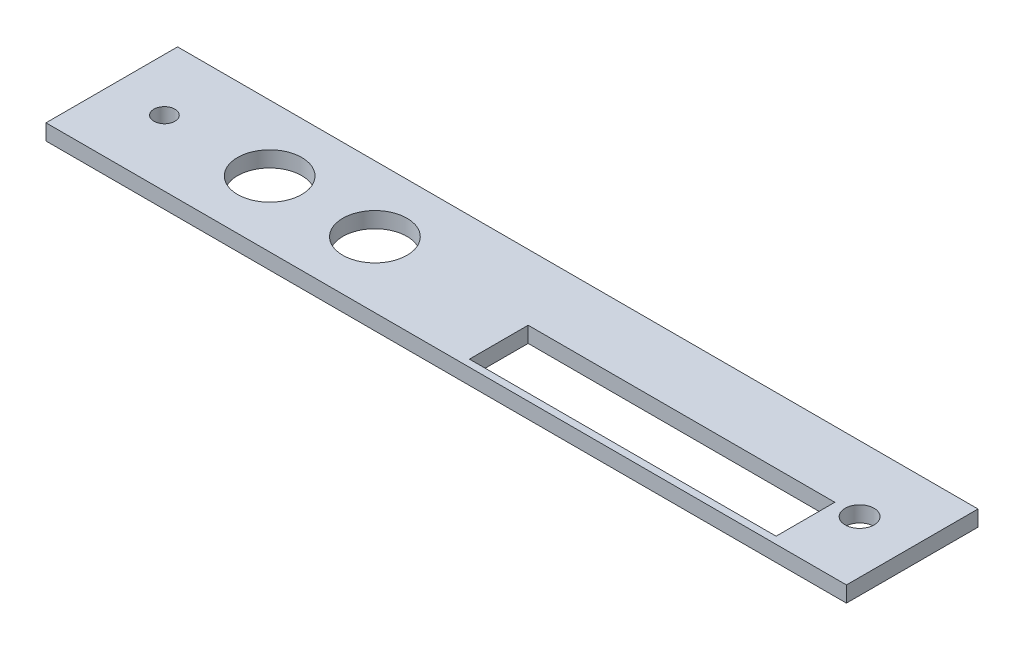
ISO-10303-21;
HEADER;
FILE_DESCRIPTION(('STEP AP214'),'2;1');
FILE_NAME('part.step','',(''),(''),'','','');
FILE_SCHEMA(('AUTOMOTIVE_DESIGN { 1 0 10303 214 1 1 1 1 }'));
ENDSEC;
DATA;
#1=APPLICATION_CONTEXT('core data for automotive mechanical design processes');
#2=APPLICATION_PROTOCOL_DEFINITION('international standard','automotive_design',2000,#1);
#3=PRODUCT_CONTEXT('',#1,'mechanical');
#4=PRODUCT('Part','Part','',(#3));
#5=PRODUCT_RELATED_PRODUCT_CATEGORY('part','',(#4));
#6=PRODUCT_DEFINITION_FORMATION('','',#4);
#7=PRODUCT_DEFINITION_CONTEXT('part definition',#1,'design');
#8=PRODUCT_DEFINITION('design','',#6,#7);
#9=PRODUCT_DEFINITION_SHAPE('','',#8);
#10=(LENGTH_UNIT() NAMED_UNIT(*) SI_UNIT(.MILLI.,.METRE.));
#11=(NAMED_UNIT(*) PLANE_ANGLE_UNIT() SI_UNIT($,.RADIAN.));
#12=(NAMED_UNIT(*) SI_UNIT($,.STERADIAN.) SOLID_ANGLE_UNIT());
#13=UNCERTAINTY_MEASURE_WITH_UNIT(LENGTH_MEASURE(1.E-05),#10,'distance_accuracy_value','');
#14=(GEOMETRIC_REPRESENTATION_CONTEXT(3) GLOBAL_UNCERTAINTY_ASSIGNED_CONTEXT((#13)) GLOBAL_UNIT_ASSIGNED_CONTEXT((#10,
#11,#12)) REPRESENTATION_CONTEXT('',''));
#15=CARTESIAN_POINT('',(0.,0.,0.));
#16=DIRECTION('',(0.,0.,1.));
#17=DIRECTION('',(1.,0.,0.));
#18=AXIS2_PLACEMENT_3D('',#15,#16,#17);
#19=CARTESIAN_POINT('',(0.,3.,0.));
#20=DIRECTION('',(0.,1.,0.));
#21=DIRECTION('',(0.,0.,1.));
#22=AXIS2_PLACEMENT_3D('',#19,#20,#21);
#23=PLANE('',#22);
#24=CARTESIAN_POINT('',(-26.5452804255806,3.,2.07298001122018));
#25=DIRECTION('',(0.,1.,0.));
#26=DIRECTION('',(0.,0.,1.));
#27=AXIS2_PLACEMENT_3D('',#24,#25,#26);
#28=CIRCLE('',#27,6.10000000000001);
#29=CARTESIAN_POINT('',(-26.5452804255806,3.,8.17298001122019));
#30=VERTEX_POINT('',#29);
#31=EDGE_CURVE('E312',#30,#30,#28,.T.);
#32=ORIENTED_EDGE('',*,*,#31,.F.);
#33=EDGE_LOOP('',(#32));
#34=FACE_BOUND('',#33,.T.);
#35=CARTESIAN_POINT('',(65.5547195744194,3.,2.07298001122018));
#36=DIRECTION('',(0.,1.,0.));
#37=DIRECTION('',(0.,0.,1.));
#38=AXIS2_PLACEMENT_3D('',#35,#36,#37);
#39=CIRCLE('',#38,2.75000000000001);
#40=CARTESIAN_POINT('',(65.5547195744194,3.,4.82298001122019));
#41=VERTEX_POINT('',#40);
#42=EDGE_CURVE('E184',#41,#41,#39,.T.);
#43=ORIENTED_EDGE('',*,*,#42,.F.);
#44=EDGE_LOOP('',(#43));
#45=FACE_BOUND('',#44,.T.);
#46=DIRECTION('',(0.,0.,-1.));
#47=VECTOR('',#46,1.);
#48=CARTESIAN_POINT('',(75.5547195744194,3.,-10.4270199887798));
#49=LINE('',#48,#47);
#50=CARTESIAN_POINT('',(75.5547195744194,3.,14.5729800112202));
#51=VERTEX_POINT('',#50);
#52=CARTESIAN_POINT('',(75.5547195744194,3.,-10.4270199887798));
#53=VERTEX_POINT('',#52);
#54=EDGE_CURVE('E192',#51,#53,#49,.T.);
#55=ORIENTED_EDGE('',*,*,#54,.T.);
#56=DIRECTION('',(-1.,0.,0.));
#57=VECTOR('',#56,1.);
#58=CARTESIAN_POINT('',(-76.5452804255805,3.,-10.4270199887798));
#59=LINE('',#58,#57);
#60=CARTESIAN_POINT('',(-76.5452804255805,3.,-10.4270199887798));
#61=VERTEX_POINT('',#60);
#62=EDGE_CURVE('E196',#53,#61,#59,.T.);
#63=ORIENTED_EDGE('',*,*,#62,.T.);
#64=DIRECTION('',(0.,0.,1.));
#65=VECTOR('',#64,1.);
#66=CARTESIAN_POINT('',(-76.5452804255805,3.,-10.4270199887798));
#67=LINE('',#66,#65);
#68=CARTESIAN_POINT('',(-76.5452804255805,3.,14.5729800112202));
#69=VERTEX_POINT('',#68);
#70=EDGE_CURVE('E200',#61,#69,#67,.T.);
#71=ORIENTED_EDGE('',*,*,#70,.T.);
#72=DIRECTION('',(1.,0.,0.));
#73=VECTOR('',#72,1.);
#74=CARTESIAN_POINT('',(-76.5452804255805,3.,14.5729800112202));
#75=LINE('',#74,#73);
#76=EDGE_CURVE('E203',#69,#51,#75,.T.);
#77=ORIENTED_EDGE('',*,*,#76,.T.);
#78=EDGE_LOOP('',(#55,#63,#71,#77));
#79=FACE_BOUND('',#78,.T.);
#80=CARTESIAN_POINT('',(-66.5452804255806,3.,2.07298001122018));
#81=DIRECTION('',(0.,1.,0.));
#82=DIRECTION('',(0.,0.,1.));
#83=AXIS2_PLACEMENT_3D('',#80,#81,#82);
#84=CIRCLE('',#83,2.00000000000001);
#85=CARTESIAN_POINT('',(-66.5452804255806,3.,4.07298001122019));
#86=VERTEX_POINT('',#85);
#87=EDGE_CURVE('E174',#86,#86,#84,.T.);
#88=ORIENTED_EDGE('',*,*,#87,.F.);
#89=EDGE_LOOP('',(#88));
#90=FACE_BOUND('',#89,.T.);
#91=DIRECTION('',(1.,0.,0.));
#92=VECTOR('',#91,1.);
#93=CARTESIAN_POINT('',(2.5743494271474,3.,13.2329324251367));
#94=LINE('',#93,#92);
#95=CARTESIAN_POINT('',(2.5743494271474,3.,13.2329324251367));
#96=VERTEX_POINT('',#95);
#97=CARTESIAN_POINT('',(60.8473982479219,3.,13.2329324251367));
#98=VERTEX_POINT('',#97);
#99=EDGE_CURVE('E131',#96,#98,#94,.T.);
#100=ORIENTED_EDGE('',*,*,#99,.F.);
#101=DIRECTION('',(0.,0.,1.));
#102=VECTOR('',#101,1.);
#103=CARTESIAN_POINT('',(2.5743494271474,3.,13.2329324251367));
#104=LINE('',#103,#102);
#105=CARTESIAN_POINT('',(2.5743494271474,3.,2.07298001122018));
#106=VERTEX_POINT('',#105);
#107=EDGE_CURVE('E122',#106,#96,#104,.T.);
#108=ORIENTED_EDGE('',*,*,#107,.F.);
#109=DIRECTION('',(-1.,0.,0.));
#110=VECTOR('',#109,1.);
#111=CARTESIAN_POINT('',(2.5743494271474,3.,2.07298001122018));
#112=LINE('',#111,#110);
#113=CARTESIAN_POINT('',(60.8473982479219,3.,2.07298001122018));
#114=VERTEX_POINT('',#113);
#115=EDGE_CURVE('E151',#114,#106,#112,.T.);
#116=ORIENTED_EDGE('',*,*,#115,.F.);
#117=DIRECTION('',(0.,0.,-1.));
#118=VECTOR('',#117,1.);
#119=CARTESIAN_POINT('',(60.8473982479219,3.,13.2329324251367));
#120=LINE('',#119,#118);
#121=EDGE_CURVE('E145',#98,#114,#120,.T.);
#122=ORIENTED_EDGE('',*,*,#121,.F.);
#123=EDGE_LOOP('',(#100,#108,#116,#122));
#124=FACE_BOUND('',#123,.T.);
#125=CARTESIAN_POINT('',(-46.5452804255806,3.,2.07298001122018));
#126=DIRECTION('',(0.,1.,0.));
#127=DIRECTION('',(0.,0.,1.));
#128=AXIS2_PLACEMENT_3D('',#125,#126,#127);
#129=CIRCLE('',#128,6.1);
#130=CARTESIAN_POINT('',(-46.5452804255806,3.,8.17298001122018));
#131=VERTEX_POINT('',#130);
#132=EDGE_CURVE('E183',#131,#131,#129,.T.);
#133=ORIENTED_EDGE('',*,*,#132,.F.);
#134=EDGE_LOOP('',(#133));
#135=FACE_BOUND('',#134,.T.);
#136=ADVANCED_FACE('F40',(#34,#45,#79,#90,#124,#135),#23,.T.);
#137=CARTESIAN_POINT('',(0.,0.,0.));
#138=DIRECTION('',(0.,1.,0.));
#139=DIRECTION('',(0.,0.,1.));
#140=AXIS2_PLACEMENT_3D('',#137,#138,#139);
#141=PLANE('',#140);
#142=CARTESIAN_POINT('',(-66.5452804255806,0.,2.07298001122018));
#143=DIRECTION('',(0.,1.,0.));
#144=DIRECTION('',(0.,0.,1.));
#145=AXIS2_PLACEMENT_3D('',#142,#143,#144);
#146=CIRCLE('',#145,2.00000000000001);
#147=CARTESIAN_POINT('',(-66.5452804255806,0.,4.07298001122019));
#148=VERTEX_POINT('',#147);
#149=EDGE_CURVE('E179',#148,#148,#146,.T.);
#150=ORIENTED_EDGE('',*,*,#149,.T.);
#151=EDGE_LOOP('',(#150));
#152=FACE_BOUND('',#151,.T.);
#153=CARTESIAN_POINT('',(65.5547195744194,0.,2.07298001122018));
#154=DIRECTION('',(0.,1.,0.));
#155=DIRECTION('',(0.,0.,1.));
#156=AXIS2_PLACEMENT_3D('',#153,#154,#155);
#157=CIRCLE('',#156,2.75000000000001);
#158=CARTESIAN_POINT('',(65.5547195744194,0.,4.82298001122019));
#159=VERTEX_POINT('',#158);
#160=EDGE_CURVE('E178',#159,#159,#157,.T.);
#161=ORIENTED_EDGE('',*,*,#160,.T.);
#162=EDGE_LOOP('',(#161));
#163=FACE_BOUND('',#162,.T.);
#164=DIRECTION('',(0.,0.,-1.));
#165=VECTOR('',#164,1.);
#166=CARTESIAN_POINT('',(75.5547195744194,0.,-10.4270199887798));
#167=LINE('',#166,#165);
#168=CARTESIAN_POINT('',(75.5547195744194,0.,14.5729800112202));
#169=VERTEX_POINT('',#168);
#170=CARTESIAN_POINT('',(75.5547195744194,0.,-10.4270199887798));
#171=VERTEX_POINT('',#170);
#172=EDGE_CURVE('E188',#169,#171,#167,.T.);
#173=ORIENTED_EDGE('',*,*,#172,.F.);
#174=DIRECTION('',(1.,0.,0.));
#175=VECTOR('',#174,1.);
#176=CARTESIAN_POINT('',(-76.5452804255805,0.,14.5729800112202));
#177=LINE('',#176,#175);
#178=CARTESIAN_POINT('',(-76.5452804255805,0.,14.5729800112202));
#179=VERTEX_POINT('',#178);
#180=EDGE_CURVE('E197',#179,#169,#177,.T.);
#181=ORIENTED_EDGE('',*,*,#180,.F.);
#182=DIRECTION('',(0.,0.,1.));
#183=VECTOR('',#182,1.);
#184=CARTESIAN_POINT('',(-76.5452804255805,0.,-10.4270199887798));
#185=LINE('',#184,#183);
#186=CARTESIAN_POINT('',(-76.5452804255805,0.,-10.4270199887798));
#187=VERTEX_POINT('',#186);
#188=EDGE_CURVE('E212',#187,#179,#185,.T.);
#189=ORIENTED_EDGE('',*,*,#188,.F.);
#190=DIRECTION('',(-1.,0.,0.));
#191=VECTOR('',#190,1.);
#192=CARTESIAN_POINT('',(-76.5452804255805,0.,-10.4270199887798));
#193=LINE('',#192,#191);
#194=EDGE_CURVE('E209',#171,#187,#193,.T.);
#195=ORIENTED_EDGE('',*,*,#194,.F.);
#196=EDGE_LOOP('',(#173,#181,#189,#195));
#197=FACE_BOUND('',#196,.T.);
#198=DIRECTION('',(0.,0.,1.));
#199=VECTOR('',#198,1.);
#200=CARTESIAN_POINT('',(2.5743494271474,0.,13.2329324251367));
#201=LINE('',#200,#199);
#202=CARTESIAN_POINT('',(2.5743494271474,0.,2.07298001122018));
#203=VERTEX_POINT('',#202);
#204=CARTESIAN_POINT('',(2.5743494271474,0.,13.2329324251367));
#205=VERTEX_POINT('',#204);
#206=EDGE_CURVE('E70',#203,#205,#201,.T.);
#207=ORIENTED_EDGE('',*,*,#206,.T.);
#208=DIRECTION('',(1.,0.,0.));
#209=VECTOR('',#208,1.);
#210=CARTESIAN_POINT('',(2.5743494271474,0.,13.2329324251367));
#211=LINE('',#210,#209);
#212=CARTESIAN_POINT('',(60.8473982479219,0.,13.2329324251367));
#213=VERTEX_POINT('',#212);
#214=EDGE_CURVE('E138',#205,#213,#211,.T.);
#215=ORIENTED_EDGE('',*,*,#214,.T.);
#216=DIRECTION('',(0.,0.,-1.));
#217=VECTOR('',#216,1.);
#218=CARTESIAN_POINT('',(60.8473982479219,0.,13.2329324251367));
#219=LINE('',#218,#217);
#220=CARTESIAN_POINT('',(60.8473982479219,0.,2.07298001122018));
#221=VERTEX_POINT('',#220);
#222=EDGE_CURVE('E161',#213,#221,#219,.T.);
#223=ORIENTED_EDGE('',*,*,#222,.T.);
#224=DIRECTION('',(-1.,0.,0.));
#225=VECTOR('',#224,1.);
#226=CARTESIAN_POINT('',(2.5743494271474,0.,2.07298001122018));
#227=LINE('',#226,#225);
#228=EDGE_CURVE('E132',#221,#203,#227,.T.);
#229=ORIENTED_EDGE('',*,*,#228,.T.);
#230=EDGE_LOOP('',(#207,#215,#223,#229));
#231=FACE_BOUND('',#230,.T.);
#232=CARTESIAN_POINT('',(-26.5452804255806,0.,2.07298001122018));
#233=DIRECTION('',(0.,1.,0.));
#234=DIRECTION('',(0.,0.,1.));
#235=AXIS2_PLACEMENT_3D('',#232,#233,#234);
#236=CIRCLE('',#235,6.10000000000001);
#237=CARTESIAN_POINT('',(-26.5452804255806,0.,8.17298001122019));
#238=VERTEX_POINT('',#237);
#239=EDGE_CURVE('E140',#238,#238,#236,.T.);
#240=ORIENTED_EDGE('',*,*,#239,.T.);
#241=EDGE_LOOP('',(#240));
#242=FACE_BOUND('',#241,.T.);
#243=CARTESIAN_POINT('',(-46.5452804255806,0.,2.07298001122018));
#244=DIRECTION('',(0.,1.,0.));
#245=DIRECTION('',(0.,0.,1.));
#246=AXIS2_PLACEMENT_3D('',#243,#244,#245);
#247=CIRCLE('',#246,6.1);
#248=CARTESIAN_POINT('',(-46.5452804255806,0.,8.17298001122018));
#249=VERTEX_POINT('',#248);
#250=EDGE_CURVE('E309',#249,#249,#247,.T.);
#251=ORIENTED_EDGE('',*,*,#250,.T.);
#252=EDGE_LOOP('',(#251));
#253=FACE_BOUND('',#252,.T.);
#254=ADVANCED_FACE('F234',(#152,#163,#197,#231,#242,#253),#141,.F.);
#255=CARTESIAN_POINT('',(75.5547195744194,3.,-10.4270199887798));
#256=DIRECTION('',(-1.,0.,0.));
#257=DIRECTION('',(0.,0.,1.));
#258=AXIS2_PLACEMENT_3D('',#255,#256,#257);
#259=PLANE('',#258);
#260=ORIENTED_EDGE('',*,*,#172,.T.);
#261=DIRECTION('',(0.,-1.,0.));
#262=VECTOR('',#261,1.);
#263=CARTESIAN_POINT('',(75.5547195744194,3.,-10.4270199887798));
#264=LINE('',#263,#262);
#265=EDGE_CURVE('E11',#53,#171,#264,.T.);
#266=ORIENTED_EDGE('',*,*,#265,.F.);
#267=ORIENTED_EDGE('',*,*,#54,.F.);
#268=DIRECTION('',(0.,-1.,0.));
#269=VECTOR('',#268,1.);
#270=CARTESIAN_POINT('',(75.5547195744194,3.,14.5729800112202));
#271=LINE('',#270,#269);
#272=EDGE_CURVE('E205',#51,#169,#271,.T.);
#273=ORIENTED_EDGE('',*,*,#272,.T.);
#274=EDGE_LOOP('',(#260,#266,#267,#273));
#275=FACE_BOUND('',#274,.T.);
#276=ADVANCED_FACE('F42',(#275),#259,.F.);
#277=CARTESIAN_POINT('',(-76.5452804255805,3.,-10.4270199887798));
#278=DIRECTION('',(0.,0.,1.));
#279=DIRECTION('',(1.,0.,0.));
#280=AXIS2_PLACEMENT_3D('',#277,#278,#279);
#281=PLANE('',#280);
#282=ORIENTED_EDGE('',*,*,#194,.T.);
#283=DIRECTION('',(0.,-1.,0.));
#284=VECTOR('',#283,1.);
#285=CARTESIAN_POINT('',(-76.5452804255805,3.,-10.4270199887798));
#286=LINE('',#285,#284);
#287=EDGE_CURVE('E49',#61,#187,#286,.T.);
#288=ORIENTED_EDGE('',*,*,#287,.F.);
#289=ORIENTED_EDGE('',*,*,#62,.F.);
#290=ORIENTED_EDGE('',*,*,#265,.T.);
#291=EDGE_LOOP('',(#282,#288,#289,#290));
#292=FACE_BOUND('',#291,.T.);
#293=ADVANCED_FACE('F245',(#292),#281,.F.);
#294=CARTESIAN_POINT('',(-76.5452804255805,3.,-10.4270199887798));
#295=DIRECTION('',(1.,0.,0.));
#296=DIRECTION('',(0.,0.,-1.));
#297=AXIS2_PLACEMENT_3D('',#294,#295,#296);
#298=PLANE('',#297);
#299=ORIENTED_EDGE('',*,*,#188,.T.);
#300=DIRECTION('',(0.,-1.,0.));
#301=VECTOR('',#300,1.);
#302=CARTESIAN_POINT('',(-76.5452804255805,3.,14.5729800112202));
#303=LINE('',#302,#301);
#304=EDGE_CURVE('E219',#69,#179,#303,.T.);
#305=ORIENTED_EDGE('',*,*,#304,.F.);
#306=ORIENTED_EDGE('',*,*,#70,.F.);
#307=ORIENTED_EDGE('',*,*,#287,.T.);
#308=EDGE_LOOP('',(#299,#305,#306,#307));
#309=FACE_BOUND('',#308,.T.);
#310=ADVANCED_FACE('F228',(#309),#298,.F.);
#311=CARTESIAN_POINT('',(-76.5452804255805,3.,14.5729800112202));
#312=DIRECTION('',(0.,0.,-1.));
#313=DIRECTION('',(-1.,0.,0.));
#314=AXIS2_PLACEMENT_3D('',#311,#312,#313);
#315=PLANE('',#314);
#316=ORIENTED_EDGE('',*,*,#180,.T.);
#317=ORIENTED_EDGE('',*,*,#272,.F.);
#318=ORIENTED_EDGE('',*,*,#76,.F.);
#319=ORIENTED_EDGE('',*,*,#304,.T.);
#320=EDGE_LOOP('',(#316,#317,#318,#319));
#321=FACE_BOUND('',#320,.T.);
#322=ADVANCED_FACE('F238',(#321),#315,.F.);
#323=CARTESIAN_POINT('',(65.5547195744194,3.,2.07298001122018));
#324=DIRECTION('',(0.,-1.,0.));
#325=DIRECTION('',(0.,0.,-1.));
#326=AXIS2_PLACEMENT_3D('',#323,#324,#325);
#327=CYLINDRICAL_SURFACE('',#326,2.75000000000001);
#328=ORIENTED_EDGE('',*,*,#42,.T.);
#329=EDGE_LOOP('',(#328));
#330=FACE_BOUND('',#329,.T.);
#331=ORIENTED_EDGE('',*,*,#160,.F.);
#332=EDGE_LOOP('',(#331));
#333=FACE_BOUND('',#332,.T.);
#334=ADVANCED_FACE('F263',(#330,#333),#327,.F.);
#335=CARTESIAN_POINT('',(-66.5452804255806,3.,2.07298001122018));
#336=DIRECTION('',(0.,-1.,0.));
#337=DIRECTION('',(0.,0.,-1.));
#338=AXIS2_PLACEMENT_3D('',#335,#336,#337);
#339=CYLINDRICAL_SURFACE('',#338,2.00000000000001);
#340=ORIENTED_EDGE('',*,*,#87,.T.);
#341=EDGE_LOOP('',(#340));
#342=FACE_BOUND('',#341,.T.);
#343=ORIENTED_EDGE('',*,*,#149,.F.);
#344=EDGE_LOOP('',(#343));
#345=FACE_BOUND('',#344,.T.);
#346=ADVANCED_FACE('F270',(#342,#345),#339,.F.);
#347=CARTESIAN_POINT('',(2.5743494271474,3.,13.2329324251367));
#348=DIRECTION('',(1.,0.,0.));
#349=DIRECTION('',(0.,0.,-1.));
#350=AXIS2_PLACEMENT_3D('',#347,#348,#349);
#351=PLANE('',#350);
#352=ORIENTED_EDGE('',*,*,#206,.F.);
#353=DIRECTION('',(0.,-1.,0.));
#354=VECTOR('',#353,1.);
#355=CARTESIAN_POINT('',(2.5743494271474,3.,2.07298001122018));
#356=LINE('',#355,#354);
#357=EDGE_CURVE('E126',#106,#203,#356,.T.);
#358=ORIENTED_EDGE('',*,*,#357,.F.);
#359=ORIENTED_EDGE('',*,*,#107,.T.);
#360=DIRECTION('',(0.,-1.,0.));
#361=VECTOR('',#360,1.);
#362=CARTESIAN_POINT('',(2.5743494271474,3.,13.2329324251367));
#363=LINE('',#362,#361);
#364=EDGE_CURVE('E125',#96,#205,#363,.T.);
#365=ORIENTED_EDGE('',*,*,#364,.T.);
#366=EDGE_LOOP('',(#352,#358,#359,#365));
#367=FACE_BOUND('',#366,.T.);
#368=ADVANCED_FACE('F124',(#367),#351,.T.);
#369=CARTESIAN_POINT('',(2.5743494271474,3.,13.2329324251367));
#370=DIRECTION('',(0.,0.,-1.));
#371=DIRECTION('',(-1.,0.,0.));
#372=AXIS2_PLACEMENT_3D('',#369,#370,#371);
#373=PLANE('',#372);
#374=ORIENTED_EDGE('',*,*,#214,.F.);
#375=ORIENTED_EDGE('',*,*,#364,.F.);
#376=ORIENTED_EDGE('',*,*,#99,.T.);
#377=DIRECTION('',(0.,-1.,0.));
#378=VECTOR('',#377,1.);
#379=CARTESIAN_POINT('',(60.8473982479219,3.,13.2329324251367));
#380=LINE('',#379,#378);
#381=EDGE_CURVE('E141',#98,#213,#380,.T.);
#382=ORIENTED_EDGE('',*,*,#381,.T.);
#383=EDGE_LOOP('',(#374,#375,#376,#382));
#384=FACE_BOUND('',#383,.T.);
#385=ADVANCED_FACE('F135',(#384),#373,.T.);
#386=CARTESIAN_POINT('',(60.8473982479219,3.,13.2329324251367));
#387=DIRECTION('',(-1.,0.,0.));
#388=DIRECTION('',(0.,0.,1.));
#389=AXIS2_PLACEMENT_3D('',#386,#387,#388);
#390=PLANE('',#389);
#391=ORIENTED_EDGE('',*,*,#222,.F.);
#392=ORIENTED_EDGE('',*,*,#381,.F.);
#393=ORIENTED_EDGE('',*,*,#121,.T.);
#394=DIRECTION('',(0.,-1.,0.));
#395=VECTOR('',#394,1.);
#396=CARTESIAN_POINT('',(60.8473982479219,3.,2.07298001122018));
#397=LINE('',#396,#395);
#398=EDGE_CURVE('E59',#114,#221,#397,.T.);
#399=ORIENTED_EDGE('',*,*,#398,.T.);
#400=EDGE_LOOP('',(#391,#392,#393,#399));
#401=FACE_BOUND('',#400,.T.);
#402=ADVANCED_FACE('F288',(#401),#390,.T.);
#403=CARTESIAN_POINT('',(2.5743494271474,3.,2.07298001122018));
#404=DIRECTION('',(0.,0.,1.));
#405=DIRECTION('',(1.,0.,0.));
#406=AXIS2_PLACEMENT_3D('',#403,#404,#405);
#407=PLANE('',#406);
#408=ORIENTED_EDGE('',*,*,#228,.F.);
#409=ORIENTED_EDGE('',*,*,#398,.F.);
#410=ORIENTED_EDGE('',*,*,#115,.T.);
#411=ORIENTED_EDGE('',*,*,#357,.T.);
#412=EDGE_LOOP('',(#408,#409,#410,#411));
#413=FACE_BOUND('',#412,.T.);
#414=ADVANCED_FACE('F291',(#413),#407,.T.);
#415=CARTESIAN_POINT('',(-26.5452804255806,3.,2.07298001122018));
#416=DIRECTION('',(0.,-1.,0.));
#417=DIRECTION('',(0.,0.,-1.));
#418=AXIS2_PLACEMENT_3D('',#415,#416,#417);
#419=CYLINDRICAL_SURFACE('',#418,6.10000000000001);
#420=ORIENTED_EDGE('',*,*,#31,.T.);
#421=EDGE_LOOP('',(#420));
#422=FACE_BOUND('',#421,.T.);
#423=ORIENTED_EDGE('',*,*,#239,.F.);
#424=EDGE_LOOP('',(#423));
#425=FACE_BOUND('',#424,.T.);
#426=ADVANCED_FACE('F295',(#422,#425),#419,.F.);
#427=CARTESIAN_POINT('',(-46.5452804255806,3.,2.07298001122018));
#428=DIRECTION('',(0.,-1.,0.));
#429=DIRECTION('',(0.,0.,-1.));
#430=AXIS2_PLACEMENT_3D('',#427,#428,#429);
#431=CYLINDRICAL_SURFACE('',#430,6.1);
#432=ORIENTED_EDGE('',*,*,#132,.T.);
#433=EDGE_LOOP('',(#432));
#434=FACE_BOUND('',#433,.T.);
#435=ORIENTED_EDGE('',*,*,#250,.F.);
#436=EDGE_LOOP('',(#435));
#437=FACE_BOUND('',#436,.T.);
#438=ADVANCED_FACE('F298',(#434,#437),#431,.F.);
#439=CLOSED_SHELL('',(#136,#254,#276,#293,#310,#322,#334,#346,#368,#385,#402,#414,#426,#438));
#440=MANIFOLD_SOLID_BREP('B2',#439);
#441=ADVANCED_BREP_SHAPE_REPRESENTATION('',(#18,#440),#14);
#442=SHAPE_DEFINITION_REPRESENTATION(#9,#441);
ENDSEC;
END-ISO-10303-21;
